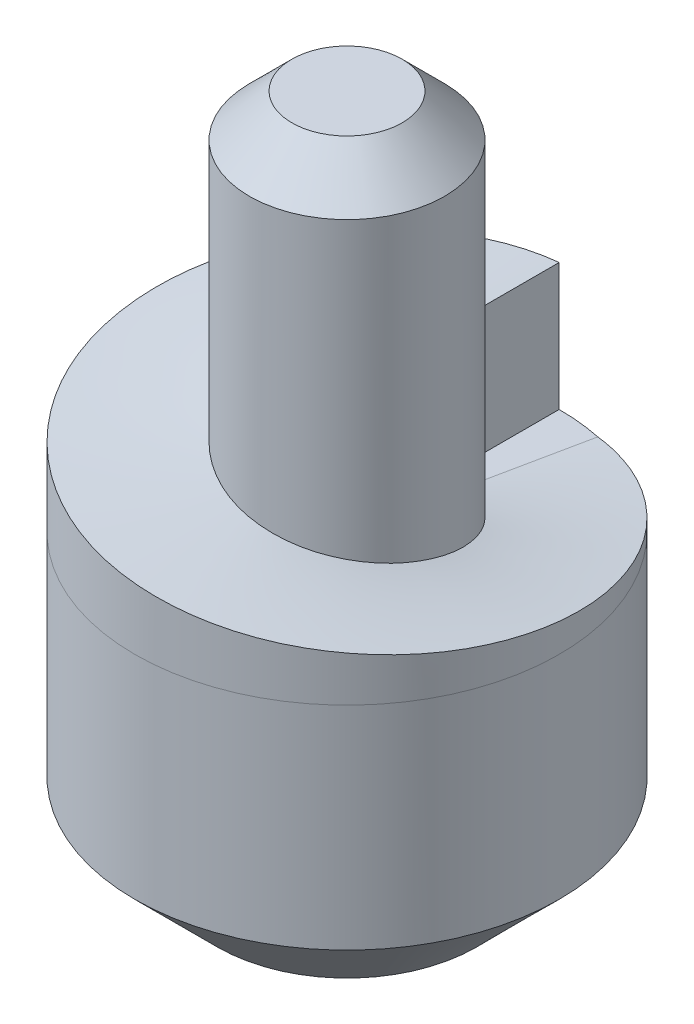
ISO-10303-21;
HEADER;
FILE_DESCRIPTION(('STEP AP214'),'2;1');
FILE_NAME('part.step','',(''),(''),'','','');
FILE_SCHEMA(('AUTOMOTIVE_DESIGN { 1 0 10303 214 1 1 1 1 }'));
ENDSEC;
DATA;
#1=APPLICATION_CONTEXT('core data for automotive mechanical design processes');
#2=APPLICATION_PROTOCOL_DEFINITION('international standard','automotive_design',2000,#1);
#3=PRODUCT_CONTEXT('',#1,'mechanical');
#4=PRODUCT('Part','Part','',(#3));
#5=PRODUCT_RELATED_PRODUCT_CATEGORY('part','',(#4));
#6=PRODUCT_DEFINITION_FORMATION('','',#4);
#7=PRODUCT_DEFINITION_CONTEXT('part definition',#1,'design');
#8=PRODUCT_DEFINITION('design','',#6,#7);
#9=PRODUCT_DEFINITION_SHAPE('','',#8);
#10=(LENGTH_UNIT() NAMED_UNIT(*) SI_UNIT(.MILLI.,.METRE.));
#11=(NAMED_UNIT(*) PLANE_ANGLE_UNIT() SI_UNIT($,.RADIAN.));
#12=(NAMED_UNIT(*) SI_UNIT($,.STERADIAN.) SOLID_ANGLE_UNIT());
#13=UNCERTAINTY_MEASURE_WITH_UNIT(LENGTH_MEASURE(1.E-05),#10,'distance_accuracy_value','');
#14=(GEOMETRIC_REPRESENTATION_CONTEXT(3) GLOBAL_UNCERTAINTY_ASSIGNED_CONTEXT((#13)) GLOBAL_UNIT_ASSIGNED_CONTEXT((#10,
#11,#12)) REPRESENTATION_CONTEXT('',''));
#15=CARTESIAN_POINT('',(0.,0.,0.));
#16=DIRECTION('',(0.,0.,1.));
#17=DIRECTION('',(1.,0.,0.));
#18=AXIS2_PLACEMENT_3D('',#15,#16,#17);
#19=CARTESIAN_POINT('',(0.,48.,-22.685905434569));
#20=DIRECTION('',(0.,1.,0.));
#21=DIRECTION('',(0.,0.,1.));
#22=AXIS2_PLACEMENT_3D('',#19,#20,#21);
#23=CYLINDRICAL_SURFACE('',#22,2.30000000000001);
#24=CARTESIAN_POINT('',(0.,47.,-22.685905434569));
#25=DIRECTION('',(0.,-1.,0.));
#26=DIRECTION('',(0.,0.,-1.));
#27=AXIS2_PLACEMENT_3D('',#24,#25,#26);
#28=CIRCLE('',#27,2.30000000000001);
#29=CARTESIAN_POINT('',(0.,47.,-24.985905434569));
#30=VERTEX_POINT('',#29);
#31=EDGE_CURVE('E11',#30,#30,#28,.T.);
#32=ORIENTED_EDGE('',*,*,#31,.T.);
#33=EDGE_LOOP('',(#32));
#34=FACE_BOUND('',#33,.T.);
#35=DIRECTION('',(0.,-1.,0.));
#36=VECTOR('',#35,1.);
#37=CARTESIAN_POINT('',(0.,40.5,-24.985905434569));
#38=LINE('',#37,#36);
#39=CARTESIAN_POINT('',(0.,42.,-24.985905434569));
#40=VERTEX_POINT('',#39);
#41=CARTESIAN_POINT('',(0.,39.,-24.985905434569));
#42=VERTEX_POINT('',#41);
#43=EDGE_CURVE('E131',#40,#42,#38,.T.);
#44=ORIENTED_EDGE('',*,*,#43,.F.);
#45=CARTESIAN_POINT('',(0.,42.,-24.985905434569));
#46=CARTESIAN_POINT('',(-0.747315301335687,41.845,-24.985905434569));
#47=CARTESIAN_POINT('',(-1.35190608027269,41.69,-24.5466445216314));
#48=CARTESIAN_POINT('',(-1.9564968592097,41.535,-24.1073836086937));
#49=CARTESIAN_POINT('',(-2.18742998747886,41.38,-23.3966445216314));
#50=CARTESIAN_POINT('',(-2.41836311574802,41.225,-22.685905434569));
#51=CARTESIAN_POINT('',(-2.18742998747886,41.07,-21.9751663475066));
#52=CARTESIAN_POINT('',(-1.9564968592097,40.915,-21.2644272604442));
#53=CARTESIAN_POINT('',(-1.35190608027269,40.76,-20.8251663475066));
#54=CARTESIAN_POINT('',(-0.747315301335687,40.605,-20.385905434569));
#55=CARTESIAN_POINT('',(0.,40.45,-20.385905434569));
#56=CARTESIAN_POINT('',(0.747315301335686,40.295,-20.385905434569));
#57=CARTESIAN_POINT('',(1.35190608027269,40.14,-20.8251663475066));
#58=CARTESIAN_POINT('',(1.9564968592097,39.985,-21.2644272604442));
#59=CARTESIAN_POINT('',(2.18742998747886,39.83,-21.9751663475066));
#60=CARTESIAN_POINT('',(2.41836311574802,39.675,-22.685905434569));
#61=CARTESIAN_POINT('',(2.18742998747886,39.52,-23.3966445216314));
#62=CARTESIAN_POINT('',(1.9564968592097,39.365,-24.1073836086937));
#63=CARTESIAN_POINT('',(1.35190608027269,39.21,-24.5466445216314));
#64=CARTESIAN_POINT('',(0.747315301335687,39.055,-24.985905434569));
#65=CARTESIAN_POINT('',(0.,38.9,-24.985905434569));
#66=(BOUNDED_CURVE() B_SPLINE_CURVE(2,(#45,#46,#47,#48,#49,#50,#51,#52,#53,#54,#55,#56,#57,#58,
#59,#60,#61,#62,#63,#64,#65),.UNSPECIFIED.,.F.,.F.) B_SPLINE_CURVE_WITH_KNOTS((3,2,2,2,2,2,2,2,
2,2,3),(0.,0.1,0.2,0.3,0.4,0.5,0.6,0.7,0.8,0.9,1.),
.UNSPECIFIED.) CURVE() GEOMETRIC_REPRESENTATION_ITEM() RATIONAL_B_SPLINE_CURVE((1.,
0.951056516295154,1.,0.951056516295154,1.,0.951056516295154,1.,0.951056516295154,1.,
0.951056516295154,1.,0.951056516295154,1.,0.951056516295154,1.,0.951056516295154,1.,
0.951056516295154,1.,0.951056516295154,1.)) REPRESENTATION_ITEM(''));
#67=CARTESIAN_POINT('',(0.466599117076019,39.,-24.9380788879122));
#68=VERTEX_POINT('',#67);
#69=EDGE_CURVE('E123',#40,#68,#66,.T.);
#70=ORIENTED_EDGE('',*,*,#69,.T.);
#71=CARTESIAN_POINT('',(0.,39.,-22.685905434569));
#72=DIRECTION('',(0.,1.,0.));
#73=DIRECTION('',(0.,0.,1.));
#74=AXIS2_PLACEMENT_3D('',#71,#72,#73);
#75=CIRCLE('',#74,2.3);
#76=EDGE_CURVE('E239',#68,#42,#75,.T.);
#77=ORIENTED_EDGE('',*,*,#76,.T.);
#78=EDGE_LOOP('',(#44,#70,#77));
#79=FACE_BOUND('',#78,.T.);
#80=ADVANCED_FACE('F43',(#34,#79),#23,.T.);
#81=CARTESIAN_POINT('',(0.,39.,-24.985905434569));
#82=DIRECTION('',(0.,-1.,0.));
#83=DIRECTION('',(0.,0.,-1.));
#84=AXIS2_PLACEMENT_3D('',#81,#82,#83);
#85=PLANE('',#84);
#86=CARTESIAN_POINT('',(1.014345906687,39.,-27.5819346809673));
#87=CARTESIAN_POINT('',(0.966351318543386,39.,-27.3502751399064));
#88=CARTESIAN_POINT('',(0.918356730399734,39.,-27.1186155988454));
#89=CARTESIAN_POINT('',(0.822367554112399,39.,-26.6552965167236));
#90=CARTESIAN_POINT('',(0.774372965968715,39.,-26.4236369756627));
#91=CARTESIAN_POINT('',(0.639785290908609,39.,-25.774011252372));
#92=CARTESIAN_POINT('',(0.553192203992204,39.,-25.3560450701421));
#93=CARTESIAN_POINT('',(0.466599117075959,39.,-24.9380788879122));
#94=B_SPLINE_CURVE_WITH_KNOTS('',3,(#86,#87,#88,#89,#90,#91,#92,#93),.UNSPECIFIED.,.F.,.F.,(4,2,
2,4),(0.,0.709737001360832,1.41947400272166,2.7),.UNSPECIFIED.);
#95=CARTESIAN_POINT('',(1.01434590668682,39.,-27.5819346809673));
#96=VERTEX_POINT('',#95);
#97=EDGE_CURVE('E138',#96,#68,#94,.T.);
#98=ORIENTED_EDGE('',*,*,#97,.F.);
#99=CARTESIAN_POINT('',(0.,39.,-22.685905434569));
#100=DIRECTION('',(0.,1.,0.));
#101=DIRECTION('',(0.,0.,1.));
#102=AXIS2_PLACEMENT_3D('',#99,#100,#101);
#103=CIRCLE('',#102,5.);
#104=CARTESIAN_POINT('',(0.,39.,-27.685905434569));
#105=VERTEX_POINT('',#104);
#106=EDGE_CURVE('E242',#96,#105,#103,.T.);
#107=ORIENTED_EDGE('',*,*,#106,.T.);
#108=DIRECTION('',(0.,0.,-1.));
#109=VECTOR('',#108,1.);
#110=CARTESIAN_POINT('',(0.,39.,-26.335905434569));
#111=LINE('',#110,#109);
#112=EDGE_CURVE('E115',#42,#105,#111,.T.);
#113=ORIENTED_EDGE('',*,*,#112,.F.);
#114=ORIENTED_EDGE('',*,*,#76,.F.);
#115=EDGE_LOOP('',(#98,#107,#113,#114));
#116=FACE_BOUND('',#115,.T.);
#117=ADVANCED_FACE('F154',(#116),#85,.F.);
#118=CARTESIAN_POINT('',(0.,48.,-22.685905434569));
#119=DIRECTION('',(0.,-1.,0.));
#120=DIRECTION('',(0.,0.,-1.));
#121=AXIS2_PLACEMENT_3D('',#118,#119,#120);
#122=PLANE('',#121);
#123=CARTESIAN_POINT('',(0.,48.,-22.685905434569));
#124=DIRECTION('',(0.,-1.,0.));
#125=DIRECTION('',(0.,0.,-1.));
#126=AXIS2_PLACEMENT_3D('',#123,#124,#125);
#127=CIRCLE('',#126,1.30000000000001);
#128=CARTESIAN_POINT('',(0.,48.,-23.985905434569));
#129=VERTEX_POINT('',#128);
#130=EDGE_CURVE('E52',#129,#129,#127,.F.);
#131=ORIENTED_EDGE('',*,*,#130,.T.);
#132=EDGE_LOOP('',(#131));
#133=FACE_BOUND('',#132,.T.);
#134=ADVANCED_FACE('F189',(#133),#122,.F.);
#135=CARTESIAN_POINT('',(0.,48.,-22.685905434569));
#136=DIRECTION('',(0.,1.,0.));
#137=DIRECTION('',(0.,0.,1.));
#138=AXIS2_PLACEMENT_3D('',#135,#136,#137);
#139=CYLINDRICAL_SURFACE('',#138,5.);
#140=ORIENTED_EDGE('',*,*,#106,.F.);
#141=EDGE_CURVE('E243',#105,#96,#103,.T.);
#142=ORIENTED_EDGE('',*,*,#141,.F.);
#143=EDGE_LOOP('',(#140,#142));
#144=FACE_BOUND('',#143,.T.);
#145=CARTESIAN_POINT('',(0.,34.,-22.685905434569));
#146=DIRECTION('',(0.,1.,0.));
#147=DIRECTION('',(0.,0.,1.));
#148=AXIS2_PLACEMENT_3D('',#145,#146,#147);
#149=CIRCLE('',#148,5.);
#150=CARTESIAN_POINT('',(0.,34.,-17.685905434569));
#151=VERTEX_POINT('',#150);
#152=EDGE_CURVE('E244',#151,#151,#149,.T.);
#153=ORIENTED_EDGE('',*,*,#152,.T.);
#154=EDGE_LOOP('',(#153));
#155=FACE_BOUND('',#154,.T.);
#156=ADVANCED_FACE('F186',(#144,#155),#139,.T.);
#157=CARTESIAN_POINT('',(0.,32.05,-22.685905434569));
#158=DIRECTION('',(0.,1.,0.));
#159=DIRECTION('',(0.,0.,1.));
#160=AXIS2_PLACEMENT_3D('',#157,#158,#159);
#161=CONICAL_SURFACE('',#160,3.05,0.785398163397449);
#162=ORIENTED_EDGE('',*,*,#152,.F.);
#163=EDGE_LOOP('',(#162));
#164=FACE_BOUND('',#163,.T.);
#165=CARTESIAN_POINT('',(0.,32.05,-22.685905434569));
#166=DIRECTION('',(0.,1.,0.));
#167=DIRECTION('',(0.,0.,1.));
#168=AXIS2_PLACEMENT_3D('',#165,#166,#167);
#169=CIRCLE('',#168,3.05);
#170=CARTESIAN_POINT('',(0.,32.05,-19.635905434569));
#171=VERTEX_POINT('',#170);
#172=EDGE_CURVE('E152',#171,#171,#169,.T.);
#173=ORIENTED_EDGE('',*,*,#172,.T.);
#174=EDGE_LOOP('',(#173));
#175=FACE_BOUND('',#174,.T.);
#176=ADVANCED_FACE('F183',(#164,#175),#161,.T.);
#177=CARTESIAN_POINT('',(0.,32.05,-22.685905434569));
#178=DIRECTION('',(0.,1.,0.));
#179=DIRECTION('',(0.,0.,1.));
#180=AXIS2_PLACEMENT_3D('',#177,#178,#179);
#181=PLANE('',#180);
#182=CARTESIAN_POINT('',(0.,32.05,-22.685905434569));
#183=DIRECTION('',(0.,1.,0.));
#184=DIRECTION('',(0.,0.,1.));
#185=AXIS2_PLACEMENT_3D('',#182,#183,#184);
#186=CIRCLE('',#185,1.3);
#187=CARTESIAN_POINT('',(-1.02469507659596,32.05,-23.485905434569));
#188=VERTEX_POINT('',#187);
#189=CARTESIAN_POINT('',(1.02469507659596,32.05,-23.485905434569));
#190=VERTEX_POINT('',#189);
#191=EDGE_CURVE('E237',#188,#190,#186,.T.);
#192=ORIENTED_EDGE('',*,*,#191,.T.);
#193=DIRECTION('',(-1.,0.,0.));
#194=VECTOR('',#193,1.);
#195=CARTESIAN_POINT('',(0.,32.05,-23.485905434569));
#196=LINE('',#195,#194);
#197=EDGE_CURVE('E232',#190,#188,#196,.T.);
#198=ORIENTED_EDGE('',*,*,#197,.T.);
#199=EDGE_LOOP('',(#192,#198));
#200=FACE_BOUND('',#199,.T.);
#201=ORIENTED_EDGE('',*,*,#172,.F.);
#202=EDGE_LOOP('',(#201));
#203=FACE_BOUND('',#202,.T.);
#204=ADVANCED_FACE('F180',(#200,#203),#181,.F.);
#205=CARTESIAN_POINT('',(0.,39.,-27.685905434569));
#206=CARTESIAN_POINT('',(-1.62459848116453,38.845,-27.685905434569));
#207=CARTESIAN_POINT('',(-2.93892626146237,38.69,-26.7309904064437));
#208=CARTESIAN_POINT('',(-4.25325404176021,38.535,-25.7760753783185));
#209=CARTESIAN_POINT('',(-4.75528258147578,38.38,-24.2309904064437));
#210=CARTESIAN_POINT('',(-5.25731112119134,38.225,-22.685905434569));
#211=CARTESIAN_POINT('',(-4.75528258147578,38.07,-21.1408204626942));
#212=CARTESIAN_POINT('',(-4.25325404176021,37.915,-19.5957354908195));
#213=CARTESIAN_POINT('',(-2.93892626146237,37.76,-18.6408204626942));
#214=CARTESIAN_POINT('',(-1.62459848116453,37.605,-17.685905434569));
#215=CARTESIAN_POINT('',(0.,37.45,-17.685905434569));
#216=CARTESIAN_POINT('',(1.62459848116453,37.295,-17.685905434569));
#217=CARTESIAN_POINT('',(2.93892626146237,37.14,-18.6408204626942));
#218=CARTESIAN_POINT('',(4.25325404176021,36.985,-19.5957354908195));
#219=CARTESIAN_POINT('',(4.75528258147578,36.83,-21.1408204626942));
#220=CARTESIAN_POINT('',(5.25731112119134,36.675,-22.685905434569));
#221=CARTESIAN_POINT('',(4.75528258147578,36.52,-24.2309904064437));
#222=CARTESIAN_POINT('',(4.25325404176021,36.365,-25.7760753783185));
#223=CARTESIAN_POINT('',(2.93892626146237,36.21,-26.7309904064437));
#224=CARTESIAN_POINT('',(1.62459848116454,36.055,-27.685905434569));
#225=CARTESIAN_POINT('',(0.,35.9,-27.685905434569));
#226=CARTESIAN_POINT('',(0.,42.,-27.685905434569));
#227=CARTESIAN_POINT('',(-1.62459848116453,41.845,-27.685905434569));
#228=CARTESIAN_POINT('',(-2.93892626146237,41.69,-26.7309904064437));
#229=CARTESIAN_POINT('',(-4.25325404176021,41.535,-25.7760753783185));
#230=CARTESIAN_POINT('',(-4.75528258147578,41.38,-24.2309904064437));
#231=CARTESIAN_POINT('',(-5.25731112119134,41.225,-22.685905434569));
#232=CARTESIAN_POINT('',(-4.75528258147578,41.07,-21.1408204626942));
#233=CARTESIAN_POINT('',(-4.25325404176021,40.915,-19.5957354908195));
#234=CARTESIAN_POINT('',(-2.93892626146237,40.76,-18.6408204626942));
#235=CARTESIAN_POINT('',(-1.62459848116453,40.605,-17.685905434569));
#236=CARTESIAN_POINT('',(0.,40.45,-17.685905434569));
#237=CARTESIAN_POINT('',(1.62459848116453,40.295,-17.685905434569));
#238=CARTESIAN_POINT('',(2.93892626146237,40.14,-18.6408204626942));
#239=CARTESIAN_POINT('',(4.25325404176021,39.985,-19.5957354908195));
#240=CARTESIAN_POINT('',(4.75528258147578,39.83,-21.1408204626942));
#241=CARTESIAN_POINT('',(5.25731112119134,39.675,-22.685905434569));
#242=CARTESIAN_POINT('',(4.75528258147578,39.52,-24.2309904064437));
#243=CARTESIAN_POINT('',(4.25325404176021,39.365,-25.7760753783185));
#244=CARTESIAN_POINT('',(2.93892626146237,39.21,-26.7309904064437));
#245=CARTESIAN_POINT('',(1.62459848116454,39.055,-27.685905434569));
#246=CARTESIAN_POINT('',(0.,38.9,-27.685905434569));
#247=(BOUNDED_SURFACE() B_SPLINE_SURFACE(1,2,((#205,#206,#207,#208,#209,#210,#211,#212,#213,
#214,#215,#216,#217,#218,#219,#220,#221,#222,#223,#224,#225),(#226,#227,#228,#229,#230,#231,
#232,#233,#234,#235,#236,#237,#238,#239,#240,#241,#242,#243,#244,#245,#246)),.UNSPECIFIED.,.F.,
.F.,.F.) B_SPLINE_SURFACE_WITH_KNOTS((2,2),(3,2,2,2,2,2,2,2,2,2,3),(0.,1.),(0.,0.1,0.2,0.3,0.4,
0.5,0.6,0.7,0.8,0.9,1.),
.UNSPECIFIED.) GEOMETRIC_REPRESENTATION_ITEM() RATIONAL_B_SPLINE_SURFACE(((1.,0.951056516295154,
1.,0.951056516295154,1.,0.951056516295154,1.,0.951056516295154,1.,0.951056516295154,1.,
0.951056516295154,1.,0.951056516295154,1.,0.951056516295154,1.,0.951056516295154,1.,
0.951056516295154,1.),(1.,0.951056516295154,1.,0.951056516295154,1.,0.951056516295154,1.,
0.951056516295154,1.,0.951056516295154,1.,0.951056516295154,1.,0.951056516295154,1.,
0.951056516295154,1.,0.951056516295154,1.,0.951056516295154,1.))) REPRESENTATION_ITEM('') SURFACE());
#248=DIRECTION('',(0.,1.,0.));
#249=VECTOR('',#248,1.);
#250=CARTESIAN_POINT('',(0.,40.5,-27.685905434569));
#251=LINE('',#250,#249);
#252=CARTESIAN_POINT('',(0.,42.,-27.685905434569));
#253=VERTEX_POINT('',#252);
#254=EDGE_CURVE('E122',#105,#253,#251,.T.);
#255=CARTESIAN_POINT('',(0.,42.,-27.685905434569));
#256=CARTESIAN_POINT('',(-1.62459848116453,41.845,-27.685905434569));
#257=CARTESIAN_POINT('',(-2.93892626146237,41.69,-26.7309904064437));
#258=CARTESIAN_POINT('',(-4.25325404176021,41.535,-25.7760753783185));
#259=CARTESIAN_POINT('',(-4.75528258147578,41.38,-24.2309904064437));
#260=CARTESIAN_POINT('',(-5.25731112119134,41.225,-22.685905434569));
#261=CARTESIAN_POINT('',(-4.75528258147578,41.07,-21.1408204626942));
#262=CARTESIAN_POINT('',(-4.25325404176021,40.915,-19.5957354908195));
#263=CARTESIAN_POINT('',(-2.93892626146237,40.76,-18.6408204626942));
#264=CARTESIAN_POINT('',(-1.62459848116453,40.605,-17.685905434569));
#265=CARTESIAN_POINT('',(0.,40.45,-17.685905434569));
#266=CARTESIAN_POINT('',(1.62459848116453,40.295,-17.685905434569));
#267=CARTESIAN_POINT('',(2.93892626146237,40.14,-18.6408204626942));
#268=CARTESIAN_POINT('',(4.25325404176021,39.985,-19.5957354908195));
#269=CARTESIAN_POINT('',(4.75528258147578,39.83,-21.1408204626942));
#270=CARTESIAN_POINT('',(5.25731112119134,39.675,-22.685905434569));
#271=CARTESIAN_POINT('',(4.75528258147578,39.52,-24.2309904064437));
#272=CARTESIAN_POINT('',(4.25325404176021,39.365,-25.7760753783185));
#273=CARTESIAN_POINT('',(2.93892626146237,39.21,-26.7309904064437));
#274=CARTESIAN_POINT('',(1.62459848116454,39.055,-27.685905434569));
#275=CARTESIAN_POINT('',(0.,38.9,-27.685905434569));
#276=(BOUNDED_CURVE() B_SPLINE_CURVE(2,(#255,#256,#257,#258,#259,#260,#261,#262,#263,#264,#265,
#266,#267,#268,#269,#270,#271,#272,#273,#274,#275),.UNSPECIFIED.,.F.,
.F.) B_SPLINE_CURVE_WITH_KNOTS((3,2,2,2,2,2,2,2,2,2,3),(0.,0.1,0.2,0.3,0.4,0.5,0.6,0.7,0.8,0.9,
1.),.UNSPECIFIED.) CURVE() GEOMETRIC_REPRESENTATION_ITEM() RATIONAL_B_SPLINE_CURVE((1.,
0.951056516295154,1.,0.951056516295154,1.,0.951056516295154,1.,0.951056516295154,1.,
0.951056516295154,1.,0.951056516295154,1.,0.951056516295154,1.,0.951056516295154,1.,
0.951056516295154,1.,0.951056516295154,1.)) REPRESENTATION_ITEM(''));
#277=EDGE_CURVE('E116',#253,#96,#276,.T.);
#278=ORIENTED_EDGE('',*,*,#254,.F.);
#279=ORIENTED_EDGE('',*,*,#141,.T.);
#280=ORIENTED_EDGE('',*,*,#277,.F.);
#281=EDGE_LOOP('',(#278,#279,#280));
#282=FACE_BOUND('',#281,.T.);
#283=ADVANCED_FACE('F166',(#282),#247,.F.);
#284=CARTESIAN_POINT('',(0.,42.,-27.685905434569));
#285=CARTESIAN_POINT('',(-1.62459848116453,41.845,-27.685905434569));
#286=CARTESIAN_POINT('',(-2.93892626146237,41.69,-26.7309904064437));
#287=CARTESIAN_POINT('',(-4.25325404176021,41.535,-25.7760753783185));
#288=CARTESIAN_POINT('',(-4.75528258147578,41.38,-24.2309904064437));
#289=CARTESIAN_POINT('',(-5.25731112119134,41.225,-22.685905434569));
#290=CARTESIAN_POINT('',(-4.75528258147578,41.07,-21.1408204626942));
#291=CARTESIAN_POINT('',(-4.25325404176021,40.915,-19.5957354908195));
#292=CARTESIAN_POINT('',(-2.93892626146237,40.76,-18.6408204626942));
#293=CARTESIAN_POINT('',(-1.62459848116453,40.605,-17.685905434569));
#294=CARTESIAN_POINT('',(0.,40.45,-17.685905434569));
#295=CARTESIAN_POINT('',(1.62459848116453,40.295,-17.685905434569));
#296=CARTESIAN_POINT('',(2.93892626146237,40.14,-18.6408204626942));
#297=CARTESIAN_POINT('',(4.25325404176021,39.985,-19.5957354908195));
#298=CARTESIAN_POINT('',(4.75528258147578,39.83,-21.1408204626942));
#299=CARTESIAN_POINT('',(5.25731112119134,39.675,-22.685905434569));
#300=CARTESIAN_POINT('',(4.75528258147578,39.52,-24.2309904064437));
#301=CARTESIAN_POINT('',(4.25325404176021,39.365,-25.7760753783185));
#302=CARTESIAN_POINT('',(2.93892626146237,39.21,-26.7309904064437));
#303=CARTESIAN_POINT('',(1.62459848116454,39.055,-27.685905434569));
#304=CARTESIAN_POINT('',(0.,38.9,-27.685905434569));
#305=CARTESIAN_POINT('',(0.,42.,-24.985905434569));
#306=CARTESIAN_POINT('',(-0.747315301335687,41.845,-24.985905434569));
#307=CARTESIAN_POINT('',(-1.35190608027269,41.69,-24.5466445216314));
#308=CARTESIAN_POINT('',(-1.9564968592097,41.535,-24.1073836086937));
#309=CARTESIAN_POINT('',(-2.18742998747886,41.38,-23.3966445216314));
#310=CARTESIAN_POINT('',(-2.41836311574802,41.225,-22.685905434569));
#311=CARTESIAN_POINT('',(-2.18742998747886,41.07,-21.9751663475066));
#312=CARTESIAN_POINT('',(-1.9564968592097,40.915,-21.2644272604442));
#313=CARTESIAN_POINT('',(-1.35190608027269,40.76,-20.8251663475066));
#314=CARTESIAN_POINT('',(-0.747315301335687,40.605,-20.385905434569));
#315=CARTESIAN_POINT('',(0.,40.45,-20.385905434569));
#316=CARTESIAN_POINT('',(0.747315301335686,40.295,-20.385905434569));
#317=CARTESIAN_POINT('',(1.35190608027269,40.14,-20.8251663475066));
#318=CARTESIAN_POINT('',(1.9564968592097,39.985,-21.2644272604442));
#319=CARTESIAN_POINT('',(2.18742998747886,39.83,-21.9751663475066));
#320=CARTESIAN_POINT('',(2.41836311574802,39.675,-22.685905434569));
#321=CARTESIAN_POINT('',(2.18742998747886,39.52,-23.3966445216314));
#322=CARTESIAN_POINT('',(1.9564968592097,39.365,-24.1073836086937));
#323=CARTESIAN_POINT('',(1.35190608027269,39.21,-24.5466445216314));
#324=CARTESIAN_POINT('',(0.747315301335687,39.055,-24.985905434569));
#325=CARTESIAN_POINT('',(0.,38.9,-24.985905434569));
#326=(BOUNDED_SURFACE() B_SPLINE_SURFACE(1,2,((#284,#285,#286,#287,#288,#289,#290,#291,#292,
#293,#294,#295,#296,#297,#298,#299,#300,#301,#302,#303,#304),(#305,#306,#307,#308,#309,#310,
#311,#312,#313,#314,#315,#316,#317,#318,#319,#320,#321,#322,#323,#324,#325)),.UNSPECIFIED.,.F.,
.F.,.F.) B_SPLINE_SURFACE_WITH_KNOTS((2,2),(3,2,2,2,2,2,2,2,2,2,3),(0.,1.),(0.,0.1,0.2,0.3,0.4,
0.5,0.6,0.7,0.8,0.9,1.),
.UNSPECIFIED.) GEOMETRIC_REPRESENTATION_ITEM() RATIONAL_B_SPLINE_SURFACE(((1.,0.951056516295154,
1.,0.951056516295154,1.,0.951056516295154,1.,0.951056516295154,1.,0.951056516295154,1.,
0.951056516295154,1.,0.951056516295154,1.,0.951056516295154,1.,0.951056516295154,1.,
0.951056516295154,1.),(1.,0.951056516295154,1.,0.951056516295154,1.,0.951056516295154,1.,
0.951056516295154,1.,0.951056516295154,1.,0.951056516295154,1.,0.951056516295154,1.,
0.951056516295154,1.,0.951056516295154,1.,0.951056516295154,1.))) REPRESENTATION_ITEM('') SURFACE());
#327=DIRECTION('',(0.,0.,1.));
#328=VECTOR('',#327,1.);
#329=CARTESIAN_POINT('',(0.,42.,-26.335905434569));
#330=LINE('',#329,#328);
#331=EDGE_CURVE('E121',#253,#40,#330,.T.);
#332=ORIENTED_EDGE('',*,*,#277,.T.);
#333=ORIENTED_EDGE('',*,*,#97,.T.);
#334=ORIENTED_EDGE('',*,*,#69,.F.);
#335=ORIENTED_EDGE('',*,*,#331,.F.);
#336=EDGE_LOOP('',(#332,#333,#334,#335));
#337=FACE_BOUND('',#336,.T.);
#338=ADVANCED_FACE('F158',(#337),#326,.F.);
#339=CARTESIAN_POINT('',(0.,40.5,-24.985905434569));
#340=DIRECTION('',(1.,0.,0.));
#341=DIRECTION('',(0.,0.,-1.));
#342=AXIS2_PLACEMENT_3D('',#339,#340,#341);
#343=PLANE('',#342);
#344=ORIENTED_EDGE('',*,*,#43,.T.);
#345=ORIENTED_EDGE('',*,*,#112,.T.);
#346=ORIENTED_EDGE('',*,*,#254,.T.);
#347=ORIENTED_EDGE('',*,*,#331,.T.);
#348=EDGE_LOOP('',(#344,#345,#346,#347));
#349=FACE_BOUND('',#348,.T.);
#350=ADVANCED_FACE('F165',(#349),#343,.T.);
#351=CARTESIAN_POINT('',(0.,37.05,-22.685905434569));
#352=DIRECTION('',(0.,-1.,0.));
#353=DIRECTION('',(0.,0.,-1.));
#354=AXIS2_PLACEMENT_3D('',#351,#352,#353);
#355=CYLINDRICAL_SURFACE('',#354,1.1);
#356=DIRECTION('',(0.,-1.,0.));
#357=VECTOR('',#356,1.);
#358=CARTESIAN_POINT('',(0.921954445729289,37.05,-23.285905434569));
#359=LINE('',#358,#357);
#360=CARTESIAN_POINT('',(0.921954445729289,37.05,-23.285905434569));
#361=VERTEX_POINT('',#360);
#362=CARTESIAN_POINT('',(0.921954445729289,32.25,-23.285905434569));
#363=VERTEX_POINT('',#362);
#364=EDGE_CURVE('E105',#361,#363,#359,.T.);
#365=ORIENTED_EDGE('',*,*,#364,.T.);
#366=CARTESIAN_POINT('',(0.,32.25,-22.685905434569));
#367=DIRECTION('',(0.,1.,0.));
#368=DIRECTION('',(0.,0.,1.));
#369=AXIS2_PLACEMENT_3D('',#366,#367,#368);
#370=CIRCLE('',#369,1.1);
#371=CARTESIAN_POINT('',(-0.921954445729289,32.25,-23.285905434569));
#372=VERTEX_POINT('',#371);
#373=EDGE_CURVE('E59',#363,#372,#370,.F.);
#374=ORIENTED_EDGE('',*,*,#373,.T.);
#375=DIRECTION('',(0.,-1.,0.));
#376=VECTOR('',#375,1.);
#377=CARTESIAN_POINT('',(-0.921954445729289,37.05,-23.285905434569));
#378=LINE('',#377,#376);
#379=CARTESIAN_POINT('',(-0.921954445729289,37.05,-23.285905434569));
#380=VERTEX_POINT('',#379);
#381=EDGE_CURVE('E97',#380,#372,#378,.T.);
#382=ORIENTED_EDGE('',*,*,#381,.F.);
#383=CARTESIAN_POINT('',(0.,37.05,-22.685905434569));
#384=DIRECTION('',(0.,-1.,0.));
#385=DIRECTION('',(0.,0.,-1.));
#386=AXIS2_PLACEMENT_3D('',#383,#384,#385);
#387=CIRCLE('',#386,1.1);
#388=EDGE_CURVE('E100',#361,#380,#387,.T.);
#389=ORIENTED_EDGE('',*,*,#388,.F.);
#390=EDGE_LOOP('',(#365,#374,#382,#389));
#391=FACE_BOUND('',#390,.T.);
#392=ADVANCED_FACE('F99',(#391),#355,.F.);
#393=CARTESIAN_POINT('',(-0.921954445729289,37.05,-23.285905434569));
#394=DIRECTION('',(0.,0.,-1.));
#395=DIRECTION('',(-1.,0.,0.));
#396=AXIS2_PLACEMENT_3D('',#393,#394,#395);
#397=PLANE('',#396);
#398=ORIENTED_EDGE('',*,*,#381,.T.);
#399=DIRECTION('',(1.,0.,0.));
#400=VECTOR('',#399,1.);
#401=CARTESIAN_POINT('',(-0.921954445729289,32.25,-23.285905434569));
#402=LINE('',#401,#400);
#403=EDGE_CURVE('E231',#372,#363,#402,.T.);
#404=ORIENTED_EDGE('',*,*,#403,.T.);
#405=ORIENTED_EDGE('',*,*,#364,.F.);
#406=DIRECTION('',(1.,0.,0.));
#407=VECTOR('',#406,1.);
#408=CARTESIAN_POINT('',(-0.921954445729289,37.05,-23.285905434569));
#409=LINE('',#408,#407);
#410=EDGE_CURVE('E106',#380,#361,#409,.T.);
#411=ORIENTED_EDGE('',*,*,#410,.F.);
#412=EDGE_LOOP('',(#398,#404,#405,#411));
#413=FACE_BOUND('',#412,.T.);
#414=ADVANCED_FACE('F111',(#413),#397,.F.);
#415=CARTESIAN_POINT('',(0.,37.05,-22.685905434569));
#416=DIRECTION('',(0.,-1.,0.));
#417=DIRECTION('',(0.,0.,-1.));
#418=AXIS2_PLACEMENT_3D('',#415,#416,#417);
#419=PLANE('',#418);
#420=ORIENTED_EDGE('',*,*,#388,.T.);
#421=ORIENTED_EDGE('',*,*,#410,.T.);
#422=EDGE_LOOP('',(#420,#421));
#423=FACE_BOUND('',#422,.T.);
#424=ADVANCED_FACE('F109',(#423),#419,.T.);
#425=CARTESIAN_POINT('',(0.,32.05,-22.685905434569));
#426=DIRECTION('',(0.,-1.,0.));
#427=DIRECTION('',(0.,0.,-1.));
#428=AXIS2_PLACEMENT_3D('',#425,#426,#427);
#429=CONICAL_SURFACE('',#428,1.3,0.785398163397466);
#430=CARTESIAN_POINT('',(-1.02469507659596,32.05,-23.485905434569));
#431=CARTESIAN_POINT('',(-1.00836970094725,32.083538091457,-23.452367343112));
#432=CARTESIAN_POINT('',(-0.991645347446627,32.1169737048397,-23.4189317297293));
#433=CARTESIAN_POINT('',(-0.957398480030752,32.1836403739566,-23.3522650606123));
#434=CARTESIAN_POINT('',(-0.939875956575816,32.2168714272406,-23.3190340073283));
#435=CARTESIAN_POINT('',(-0.921954445729289,32.25,-23.285905434569));
#436=B_SPLINE_CURVE_WITH_KNOTS('',3,(#430,#431,#432,#433,#434,#435),.UNSPECIFIED.,.F.,.F.,(4,2,
4),(0.,0.150466808170696,0.300935415184283),.UNSPECIFIED.);
#437=EDGE_CURVE('E218',#372,#188,#436,.F.);
#438=ORIENTED_EDGE('',*,*,#437,.F.);
#439=ORIENTED_EDGE('',*,*,#373,.F.);
#440=CARTESIAN_POINT('',(0.921954445729289,32.25,-23.285905434569));
#441=CARTESIAN_POINT('',(0.939875956575816,32.2168714272406,-23.3190340073283));
#442=CARTESIAN_POINT('',(0.957398480030752,32.1836403739566,-23.3522650606123));
#443=CARTESIAN_POINT('',(0.991645347446626,32.1169737048397,-23.4189317297293));
#444=CARTESIAN_POINT('',(1.00836970094725,32.083538091457,-23.452367343112));
#445=CARTESIAN_POINT('',(1.02469507659596,32.05,-23.485905434569));
#446=B_SPLINE_CURVE_WITH_KNOTS('',3,(#440,#441,#442,#443,#444,#445),.UNSPECIFIED.,.F.,.F.,(4,2,
4),(0.,0.150468607013588,0.300935415184283),.UNSPECIFIED.);
#447=EDGE_CURVE('E67',#190,#363,#446,.F.);
#448=ORIENTED_EDGE('',*,*,#447,.F.);
#449=ORIENTED_EDGE('',*,*,#191,.F.);
#450=EDGE_LOOP('',(#438,#439,#448,#449));
#451=FACE_BOUND('',#450,.T.);
#452=ADVANCED_FACE('F214',(#451),#429,.F.);
#453=CARTESIAN_POINT('',(0.,32.05,-23.485905434569));
#454=DIRECTION('',(0.,0.70710678118656,-0.707106781186535));
#455=DIRECTION('',(-1.,0.,0.));
#456=AXIS2_PLACEMENT_3D('',#453,#454,#455);
#457=PLANE('',#456);
#458=ORIENTED_EDGE('',*,*,#447,.T.);
#459=ORIENTED_EDGE('',*,*,#403,.F.);
#460=ORIENTED_EDGE('',*,*,#437,.T.);
#461=ORIENTED_EDGE('',*,*,#197,.F.);
#462=EDGE_LOOP('',(#458,#459,#460,#461));
#463=FACE_BOUND('',#462,.T.);
#464=ADVANCED_FACE('F209',(#463),#457,.F.);
#465=CARTESIAN_POINT('',(0.,48.,-22.685905434569));
#466=DIRECTION('',(0.,-1.,0.));
#467=DIRECTION('',(0.,0.,-1.));
#468=AXIS2_PLACEMENT_3D('',#465,#466,#467);
#469=CONICAL_SURFACE('',#468,1.30000000000001,0.785398163397447);
#470=ORIENTED_EDGE('',*,*,#31,.F.);
#471=EDGE_LOOP('',(#470));
#472=FACE_BOUND('',#471,.T.);
#473=ORIENTED_EDGE('',*,*,#130,.F.);
#474=EDGE_LOOP('',(#473));
#475=FACE_BOUND('',#474,.T.);
#476=ADVANCED_FACE('F46',(#472,#475),#469,.T.);
#477=CLOSED_SHELL('',(#80,#117,#134,#156,#176,#204,#283,#338,#350,#392,#414,#424,#452,#464,#476));
#478=MANIFOLD_SOLID_BREP('B2',#477);
#479=ADVANCED_BREP_SHAPE_REPRESENTATION('',(#18,#478),#14);
#480=SHAPE_DEFINITION_REPRESENTATION(#9,#479);
ENDSEC;
END-ISO-10303-21;
